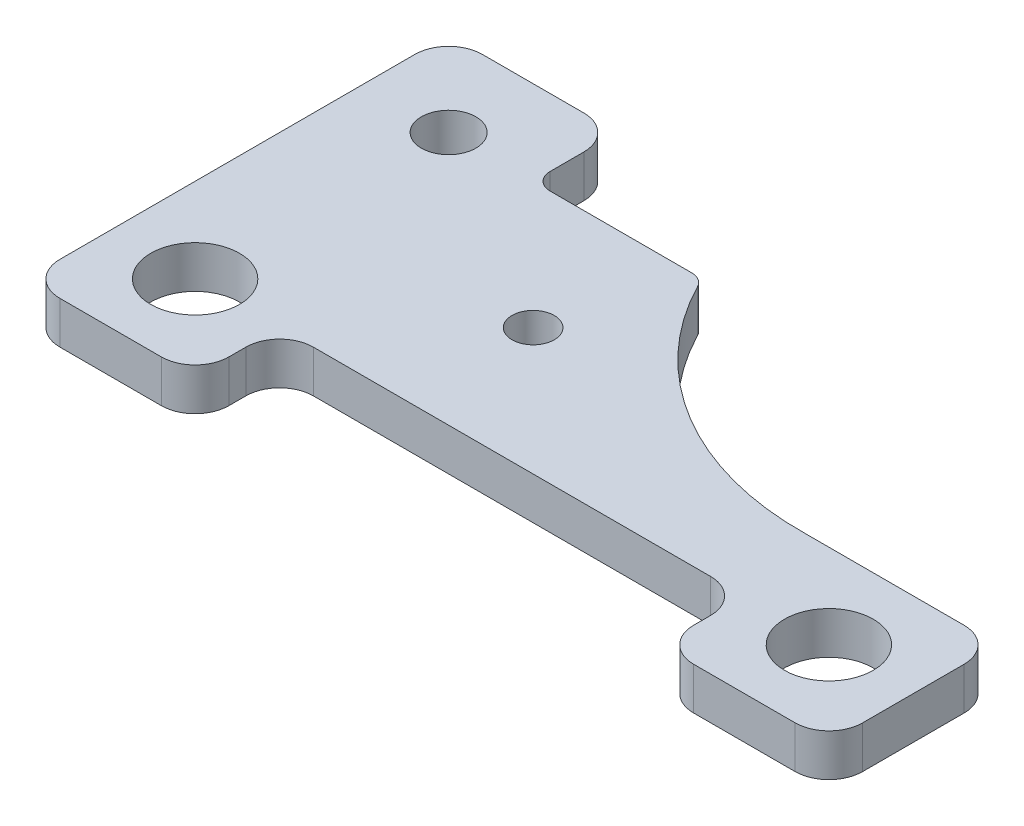
ISO-10303-21;
HEADER;
FILE_DESCRIPTION(('STEP AP214'),'2;1');
FILE_NAME('part.step','',(''),(''),'','','');
FILE_SCHEMA(('AUTOMOTIVE_DESIGN { 1 0 10303 214 1 1 1 1 }'));
ENDSEC;
DATA;
#1=APPLICATION_CONTEXT('core data for automotive mechanical design processes');
#2=APPLICATION_PROTOCOL_DEFINITION('international standard','automotive_design',2000,#1);
#3=PRODUCT_CONTEXT('',#1,'mechanical');
#4=PRODUCT('Part','Part','',(#3));
#5=PRODUCT_RELATED_PRODUCT_CATEGORY('part','',(#4));
#6=PRODUCT_DEFINITION_FORMATION('','',#4);
#7=PRODUCT_DEFINITION_CONTEXT('part definition',#1,'design');
#8=PRODUCT_DEFINITION('design','',#6,#7);
#9=PRODUCT_DEFINITION_SHAPE('','',#8);
#10=(LENGTH_UNIT() NAMED_UNIT(*) SI_UNIT(.MILLI.,.METRE.));
#11=(NAMED_UNIT(*) PLANE_ANGLE_UNIT() SI_UNIT($,.RADIAN.));
#12=(NAMED_UNIT(*) SI_UNIT($,.STERADIAN.) SOLID_ANGLE_UNIT());
#13=UNCERTAINTY_MEASURE_WITH_UNIT(LENGTH_MEASURE(1.E-05),#10,'distance_accuracy_value','');
#14=(GEOMETRIC_REPRESENTATION_CONTEXT(3) GLOBAL_UNCERTAINTY_ASSIGNED_CONTEXT((#13)) GLOBAL_UNIT_ASSIGNED_CONTEXT((#10,
#11,#12)) REPRESENTATION_CONTEXT('',''));
#15=CARTESIAN_POINT('',(0.,0.,0.));
#16=DIRECTION('',(0.,0.,1.));
#17=DIRECTION('',(1.,0.,0.));
#18=AXIS2_PLACEMENT_3D('',#15,#16,#17);
#19=CARTESIAN_POINT('',(38.7591831153131,5.,12.));
#20=DIRECTION('',(0.,-1.,0.));
#21=DIRECTION('',(0.,0.,-1.));
#22=AXIS2_PLACEMENT_3D('',#19,#20,#21);
#23=CYLINDRICAL_SURFACE('',#22,2.);
#24=CARTESIAN_POINT('',(38.7591831153131,0.,12.));
#25=DIRECTION('',(0.,1.,0.));
#26=DIRECTION('',(0.,0.,1.));
#27=AXIS2_PLACEMENT_3D('',#24,#25,#26);
#28=CIRCLE('',#27,2.);
#29=CARTESIAN_POINT('',(38.7591831153131,0.,10.));
#30=VERTEX_POINT('',#29);
#31=CARTESIAN_POINT('',(40.5357368291254,0.,11.0813831582538));
#32=VERTEX_POINT('',#31);
#33=EDGE_CURVE('E311',#30,#32,#28,.F.);
#34=ORIENTED_EDGE('',*,*,#33,.F.);
#35=DIRECTION('',(0.,-1.,0.));
#36=VECTOR('',#35,1.);
#37=CARTESIAN_POINT('',(38.7591831153131,5.,10.));
#38=LINE('',#37,#36);
#39=CARTESIAN_POINT('',(38.7591831153131,5.,10.));
#40=VERTEX_POINT('',#39);
#41=EDGE_CURVE('E11',#40,#30,#38,.T.);
#42=ORIENTED_EDGE('',*,*,#41,.F.);
#43=CARTESIAN_POINT('',(38.7591831153131,5.,12.));
#44=DIRECTION('',(0.,1.,0.));
#45=DIRECTION('',(0.,0.,1.));
#46=AXIS2_PLACEMENT_3D('',#43,#44,#45);
#47=CIRCLE('',#46,2.);
#48=CARTESIAN_POINT('',(40.5357368291254,5.,11.0813831582538));
#49=VERTEX_POINT('',#48);
#50=EDGE_CURVE('E586',#40,#49,#47,.F.);
#51=ORIENTED_EDGE('',*,*,#50,.T.);
#52=DIRECTION('',(0.,-1.,0.));
#53=VECTOR('',#52,1.);
#54=CARTESIAN_POINT('',(40.5357368291254,5.,11.0813831582538));
#55=LINE('',#54,#53);
#56=EDGE_CURVE('E57',#49,#32,#55,.T.);
#57=ORIENTED_EDGE('',*,*,#56,.T.);
#58=EDGE_LOOP('',(#34,#42,#51,#57));
#59=FACE_BOUND('',#58,.T.);
#60=ADVANCED_FACE('F39',(#59),#23,.T.);
#61=CARTESIAN_POINT('',(0.,5.,10.));
#62=DIRECTION('',(0.,0.,-1.));
#63=DIRECTION('',(-1.,0.,0.));
#64=AXIS2_PLACEMENT_3D('',#61,#62,#63);
#65=PLANE('',#64);
#66=DIRECTION('',(1.,0.,0.));
#67=VECTOR('',#66,1.);
#68=CARTESIAN_POINT('',(0.,0.,10.));
#69=LINE('',#68,#67);
#70=CARTESIAN_POINT('',(22.,0.,10.));
#71=VERTEX_POINT('',#70);
#72=EDGE_CURVE('E307',#71,#30,#69,.T.);
#73=ORIENTED_EDGE('',*,*,#72,.F.);
#74=DIRECTION('',(0.,-1.,0.));
#75=VECTOR('',#74,1.);
#76=CARTESIAN_POINT('',(22.,5.,10.));
#77=LINE('',#76,#75);
#78=CARTESIAN_POINT('',(22.,5.,10.));
#79=VERTEX_POINT('',#78);
#80=EDGE_CURVE('E49',#79,#71,#77,.T.);
#81=ORIENTED_EDGE('',*,*,#80,.F.);
#82=DIRECTION('',(1.,0.,0.));
#83=VECTOR('',#82,1.);
#84=CARTESIAN_POINT('',(0.,5.,10.));
#85=LINE('',#84,#83);
#86=EDGE_CURVE('E590',#79,#40,#85,.T.);
#87=ORIENTED_EDGE('',*,*,#86,.T.);
#88=ORIENTED_EDGE('',*,*,#41,.T.);
#89=EDGE_LOOP('',(#73,#81,#87,#88));
#90=FACE_BOUND('',#89,.T.);
#91=ADVANCED_FACE('F308',(#90),#65,.T.);
#92=CARTESIAN_POINT('',(22.,5.,8.));
#93=DIRECTION('',(0.,-1.,0.));
#94=DIRECTION('',(0.,0.,-1.));
#95=AXIS2_PLACEMENT_3D('',#92,#93,#94);
#96=CYLINDRICAL_SURFACE('',#95,2.);
#97=CARTESIAN_POINT('',(22.,0.,8.));
#98=DIRECTION('',(0.,1.,0.));
#99=DIRECTION('',(0.,0.,1.));
#100=AXIS2_PLACEMENT_3D('',#97,#98,#99);
#101=CIRCLE('',#100,2.);
#102=CARTESIAN_POINT('',(20.,0.,7.99999999999999));
#103=VERTEX_POINT('',#102);
#104=EDGE_CURVE('E299',#103,#71,#101,.T.);
#105=ORIENTED_EDGE('',*,*,#104,.F.);
#106=DIRECTION('',(0.,-1.,0.));
#107=VECTOR('',#106,1.);
#108=CARTESIAN_POINT('',(20.,5.,7.99999999999999));
#109=LINE('',#108,#107);
#110=CARTESIAN_POINT('',(20.,5.,7.99999999999999));
#111=VERTEX_POINT('',#110);
#112=EDGE_CURVE('E290',#111,#103,#109,.T.);
#113=ORIENTED_EDGE('',*,*,#112,.F.);
#114=CARTESIAN_POINT('',(22.,5.,8.));
#115=DIRECTION('',(0.,1.,0.));
#116=DIRECTION('',(0.,0.,1.));
#117=AXIS2_PLACEMENT_3D('',#114,#115,#116);
#118=CIRCLE('',#117,2.);
#119=EDGE_CURVE('E302',#111,#79,#118,.T.);
#120=ORIENTED_EDGE('',*,*,#119,.T.);
#121=ORIENTED_EDGE('',*,*,#80,.T.);
#122=EDGE_LOOP('',(#105,#113,#120,#121));
#123=FACE_BOUND('',#122,.T.);
#124=ADVANCED_FACE('F297',(#123),#96,.F.);
#125=CARTESIAN_POINT('',(20.,5.,0.));
#126=DIRECTION('',(1.,0.,0.));
#127=DIRECTION('',(0.,0.,-1.));
#128=AXIS2_PLACEMENT_3D('',#125,#126,#127);
#129=PLANE('',#128);
#130=DIRECTION('',(0.,0.,1.));
#131=VECTOR('',#130,1.);
#132=CARTESIAN_POINT('',(20.,0.,0.));
#133=LINE('',#132,#131);
#134=CARTESIAN_POINT('',(20.,0.,4.00000000000003));
#135=VERTEX_POINT('',#134);
#136=EDGE_CURVE('E317',#135,#103,#133,.T.);
#137=ORIENTED_EDGE('',*,*,#136,.F.);
#138=DIRECTION('',(0.,-1.,0.));
#139=VECTOR('',#138,1.);
#140=CARTESIAN_POINT('',(20.,5.,4.00000000000003));
#141=LINE('',#140,#139);
#142=CARTESIAN_POINT('',(20.,5.,4.00000000000003));
#143=VERTEX_POINT('',#142);
#144=EDGE_CURVE('E287',#143,#135,#141,.T.);
#145=ORIENTED_EDGE('',*,*,#144,.F.);
#146=DIRECTION('',(0.,0.,1.));
#147=VECTOR('',#146,1.);
#148=CARTESIAN_POINT('',(20.,5.,0.));
#149=LINE('',#148,#147);
#150=EDGE_CURVE('E598',#143,#111,#149,.T.);
#151=ORIENTED_EDGE('',*,*,#150,.T.);
#152=ORIENTED_EDGE('',*,*,#112,.T.);
#153=EDGE_LOOP('',(#137,#145,#151,#152));
#154=FACE_BOUND('',#153,.T.);
#155=ADVANCED_FACE('F447',(#154),#129,.T.);
#156=CARTESIAN_POINT('',(16.,5.,4.));
#157=DIRECTION('',(0.,-1.,0.));
#158=DIRECTION('',(0.,0.,-1.));
#159=AXIS2_PLACEMENT_3D('',#156,#157,#158);
#160=CYLINDRICAL_SURFACE('',#159,4.);
#161=CARTESIAN_POINT('',(16.,0.,4.));
#162=DIRECTION('',(0.,1.,0.));
#163=DIRECTION('',(0.,0.,1.));
#164=AXIS2_PLACEMENT_3D('',#161,#162,#163);
#165=CIRCLE('',#164,4.);
#166=CARTESIAN_POINT('',(16.,0.,0.));
#167=VERTEX_POINT('',#166);
#168=EDGE_CURVE('E321',#167,#135,#165,.F.);
#169=ORIENTED_EDGE('',*,*,#168,.F.);
#170=DIRECTION('',(0.,-1.,0.));
#171=VECTOR('',#170,1.);
#172=CARTESIAN_POINT('',(16.,5.,0.));
#173=LINE('',#172,#171);
#174=CARTESIAN_POINT('',(16.,5.,0.));
#175=VERTEX_POINT('',#174);
#176=EDGE_CURVE('E284',#175,#167,#173,.T.);
#177=ORIENTED_EDGE('',*,*,#176,.F.);
#178=CARTESIAN_POINT('',(16.,5.,4.));
#179=DIRECTION('',(0.,1.,0.));
#180=DIRECTION('',(0.,0.,1.));
#181=AXIS2_PLACEMENT_3D('',#178,#179,#180);
#182=CIRCLE('',#181,4.);
#183=EDGE_CURVE('E602',#175,#143,#182,.F.);
#184=ORIENTED_EDGE('',*,*,#183,.T.);
#185=ORIENTED_EDGE('',*,*,#144,.T.);
#186=EDGE_LOOP('',(#169,#177,#184,#185));
#187=FACE_BOUND('',#186,.T.);
#188=ADVANCED_FACE('F450',(#187),#160,.T.);
#189=CARTESIAN_POINT('',(0.,5.,0.));
#190=DIRECTION('',(0.,0.,-1.));
#191=DIRECTION('',(-1.,0.,0.));
#192=AXIS2_PLACEMENT_3D('',#189,#190,#191);
#193=PLANE('',#192);
#194=DIRECTION('',(1.,0.,0.));
#195=VECTOR('',#194,1.);
#196=CARTESIAN_POINT('',(0.,0.,0.));
#197=LINE('',#196,#195);
#198=CARTESIAN_POINT('',(4.00000000000003,0.,0.));
#199=VERTEX_POINT('',#198);
#200=EDGE_CURVE('E327',#199,#167,#197,.T.);
#201=ORIENTED_EDGE('',*,*,#200,.F.);
#202=DIRECTION('',(0.,-1.,0.));
#203=VECTOR('',#202,1.);
#204=CARTESIAN_POINT('',(4.00000000000003,5.,0.));
#205=LINE('',#204,#203);
#206=CARTESIAN_POINT('',(4.00000000000003,5.,0.));
#207=VERTEX_POINT('',#206);
#208=EDGE_CURVE('E281',#207,#199,#205,.T.);
#209=ORIENTED_EDGE('',*,*,#208,.F.);
#210=DIRECTION('',(1.,0.,0.));
#211=VECTOR('',#210,1.);
#212=CARTESIAN_POINT('',(0.,5.,0.));
#213=LINE('',#212,#211);
#214=EDGE_CURVE('E606',#207,#175,#213,.T.);
#215=ORIENTED_EDGE('',*,*,#214,.T.);
#216=ORIENTED_EDGE('',*,*,#176,.T.);
#217=EDGE_LOOP('',(#201,#209,#215,#216));
#218=FACE_BOUND('',#217,.T.);
#219=ADVANCED_FACE('F454',(#218),#193,.T.);
#220=CARTESIAN_POINT('',(4.,5.,4.));
#221=DIRECTION('',(0.,-1.,0.));
#222=DIRECTION('',(0.,0.,-1.));
#223=AXIS2_PLACEMENT_3D('',#220,#221,#222);
#224=CYLINDRICAL_SURFACE('',#223,4.);
#225=CARTESIAN_POINT('',(4.,0.,4.));
#226=DIRECTION('',(0.,1.,0.));
#227=DIRECTION('',(0.,0.,1.));
#228=AXIS2_PLACEMENT_3D('',#225,#226,#227);
#229=CIRCLE('',#228,4.);
#230=CARTESIAN_POINT('',(0.,0.,4.00000000000003));
#231=VERTEX_POINT('',#230);
#232=EDGE_CURVE('E331',#231,#199,#229,.F.);
#233=ORIENTED_EDGE('',*,*,#232,.F.);
#234=DIRECTION('',(0.,-1.,0.));
#235=VECTOR('',#234,1.);
#236=CARTESIAN_POINT('',(0.,5.,4.00000000000003));
#237=LINE('',#236,#235);
#238=CARTESIAN_POINT('',(0.,5.,4.00000000000003));
#239=VERTEX_POINT('',#238);
#240=EDGE_CURVE('E278',#239,#231,#237,.T.);
#241=ORIENTED_EDGE('',*,*,#240,.F.);
#242=CARTESIAN_POINT('',(4.,5.,4.));
#243=DIRECTION('',(0.,1.,0.));
#244=DIRECTION('',(0.,0.,1.));
#245=AXIS2_PLACEMENT_3D('',#242,#243,#244);
#246=CIRCLE('',#245,4.);
#247=EDGE_CURVE('E610',#239,#207,#246,.F.);
#248=ORIENTED_EDGE('',*,*,#247,.T.);
#249=ORIENTED_EDGE('',*,*,#208,.T.);
#250=EDGE_LOOP('',(#233,#241,#248,#249));
#251=FACE_BOUND('',#250,.T.);
#252=ADVANCED_FACE('F458',(#251),#224,.T.);
#253=CARTESIAN_POINT('',(0.,5.,0.));
#254=DIRECTION('',(1.,0.,0.));
#255=DIRECTION('',(0.,0.,-1.));
#256=AXIS2_PLACEMENT_3D('',#253,#254,#255);
#257=PLANE('',#256);
#258=DIRECTION('',(0.,0.,1.));
#259=VECTOR('',#258,1.);
#260=CARTESIAN_POINT('',(0.,0.,0.));
#261=LINE('',#260,#259);
#262=CARTESIAN_POINT('',(0.,0.,46.));
#263=VERTEX_POINT('',#262);
#264=EDGE_CURVE('E335',#231,#263,#261,.T.);
#265=ORIENTED_EDGE('',*,*,#264,.T.);
#266=DIRECTION('',(0.,-1.,0.));
#267=VECTOR('',#266,1.);
#268=CARTESIAN_POINT('',(0.,5.,46.));
#269=LINE('',#268,#267);
#270=CARTESIAN_POINT('',(0.,5.,46.));
#271=VERTEX_POINT('',#270);
#272=EDGE_CURVE('E274',#271,#263,#269,.T.);
#273=ORIENTED_EDGE('',*,*,#272,.F.);
#274=DIRECTION('',(0.,0.,1.));
#275=VECTOR('',#274,1.);
#276=CARTESIAN_POINT('',(0.,5.,0.));
#277=LINE('',#276,#275);
#278=EDGE_CURVE('E614',#239,#271,#277,.T.);
#279=ORIENTED_EDGE('',*,*,#278,.F.);
#280=ORIENTED_EDGE('',*,*,#240,.T.);
#281=EDGE_LOOP('',(#265,#273,#279,#280));
#282=FACE_BOUND('',#281,.T.);
#283=ADVANCED_FACE('F462',(#282),#257,.F.);
#284=CARTESIAN_POINT('',(4.,5.,46.));
#285=DIRECTION('',(0.,-1.,0.));
#286=DIRECTION('',(0.,0.,-1.));
#287=AXIS2_PLACEMENT_3D('',#284,#285,#286);
#288=CYLINDRICAL_SURFACE('',#287,4.);
#289=CARTESIAN_POINT('',(4.,0.,46.));
#290=DIRECTION('',(0.,1.,0.));
#291=DIRECTION('',(0.,0.,1.));
#292=AXIS2_PLACEMENT_3D('',#289,#290,#291);
#293=CIRCLE('',#292,4.);
#294=CARTESIAN_POINT('',(4.00000000000003,0.,50.));
#295=VERTEX_POINT('',#294);
#296=EDGE_CURVE('E339',#263,#295,#293,.T.);
#297=ORIENTED_EDGE('',*,*,#296,.T.);
#298=DIRECTION('',(0.,-1.,0.));
#299=VECTOR('',#298,1.);
#300=CARTESIAN_POINT('',(4.00000000000003,5.,50.));
#301=LINE('',#300,#299);
#302=CARTESIAN_POINT('',(4.00000000000003,5.,50.));
#303=VERTEX_POINT('',#302);
#304=EDGE_CURVE('E270',#303,#295,#301,.T.);
#305=ORIENTED_EDGE('',*,*,#304,.F.);
#306=CARTESIAN_POINT('',(4.,5.,46.));
#307=DIRECTION('',(0.,1.,0.));
#308=DIRECTION('',(0.,0.,1.));
#309=AXIS2_PLACEMENT_3D('',#306,#307,#308);
#310=CIRCLE('',#309,4.);
#311=EDGE_CURVE('E618',#271,#303,#310,.T.);
#312=ORIENTED_EDGE('',*,*,#311,.F.);
#313=ORIENTED_EDGE('',*,*,#272,.T.);
#314=EDGE_LOOP('',(#297,#305,#312,#313));
#315=FACE_BOUND('',#314,.T.);
#316=ADVANCED_FACE('F466',(#315),#288,.T.);
#317=CARTESIAN_POINT('',(0.,5.,50.));
#318=DIRECTION('',(0.,0.,-1.));
#319=DIRECTION('',(-1.,0.,0.));
#320=AXIS2_PLACEMENT_3D('',#317,#318,#319);
#321=PLANE('',#320);
#322=DIRECTION('',(1.,0.,0.));
#323=VECTOR('',#322,1.);
#324=CARTESIAN_POINT('',(0.,0.,50.));
#325=LINE('',#324,#323);
#326=CARTESIAN_POINT('',(16.,0.,50.));
#327=VERTEX_POINT('',#326);
#328=EDGE_CURVE('E343',#295,#327,#325,.T.);
#329=ORIENTED_EDGE('',*,*,#328,.T.);
#330=DIRECTION('',(0.,-1.,0.));
#331=VECTOR('',#330,1.);
#332=CARTESIAN_POINT('',(16.,5.,50.));
#333=LINE('',#332,#331);
#334=CARTESIAN_POINT('',(16.,5.,50.));
#335=VERTEX_POINT('',#334);
#336=EDGE_CURVE('E266',#335,#327,#333,.T.);
#337=ORIENTED_EDGE('',*,*,#336,.F.);
#338=DIRECTION('',(1.,0.,0.));
#339=VECTOR('',#338,1.);
#340=CARTESIAN_POINT('',(0.,5.,50.));
#341=LINE('',#340,#339);
#342=EDGE_CURVE('E622',#303,#335,#341,.T.);
#343=ORIENTED_EDGE('',*,*,#342,.F.);
#344=ORIENTED_EDGE('',*,*,#304,.T.);
#345=EDGE_LOOP('',(#329,#337,#343,#344));
#346=FACE_BOUND('',#345,.T.);
#347=ADVANCED_FACE('F470',(#346),#321,.F.);
#348=CARTESIAN_POINT('',(16.,5.,46.));
#349=DIRECTION('',(0.,-1.,0.));
#350=DIRECTION('',(0.,0.,-1.));
#351=AXIS2_PLACEMENT_3D('',#348,#349,#350);
#352=CYLINDRICAL_SURFACE('',#351,4.);
#353=CARTESIAN_POINT('',(16.,0.,46.));
#354=DIRECTION('',(0.,1.,0.));
#355=DIRECTION('',(0.,0.,1.));
#356=AXIS2_PLACEMENT_3D('',#353,#354,#355);
#357=CIRCLE('',#356,4.);
#358=CARTESIAN_POINT('',(20.,0.,46.));
#359=VERTEX_POINT('',#358);
#360=EDGE_CURVE('E347',#327,#359,#357,.T.);
#361=ORIENTED_EDGE('',*,*,#360,.T.);
#362=DIRECTION('',(0.,-1.,0.));
#363=VECTOR('',#362,1.);
#364=CARTESIAN_POINT('',(20.,5.,46.));
#365=LINE('',#364,#363);
#366=CARTESIAN_POINT('',(20.,5.,46.));
#367=VERTEX_POINT('',#366);
#368=EDGE_CURVE('E262',#367,#359,#365,.T.);
#369=ORIENTED_EDGE('',*,*,#368,.F.);
#370=CARTESIAN_POINT('',(16.,5.,46.));
#371=DIRECTION('',(0.,1.,0.));
#372=DIRECTION('',(0.,0.,1.));
#373=AXIS2_PLACEMENT_3D('',#370,#371,#372);
#374=CIRCLE('',#373,4.);
#375=EDGE_CURVE('E626',#335,#367,#374,.T.);
#376=ORIENTED_EDGE('',*,*,#375,.F.);
#377=ORIENTED_EDGE('',*,*,#336,.T.);
#378=EDGE_LOOP('',(#361,#369,#376,#377));
#379=FACE_BOUND('',#378,.T.);
#380=ADVANCED_FACE('F474',(#379),#352,.T.);
#381=CARTESIAN_POINT('',(20.,5.,0.));
#382=DIRECTION('',(-1.,0.,0.));
#383=DIRECTION('',(0.,0.,1.));
#384=AXIS2_PLACEMENT_3D('',#381,#382,#383);
#385=PLANE('',#384);
#386=DIRECTION('',(0.,0.,-1.));
#387=VECTOR('',#386,1.);
#388=CARTESIAN_POINT('',(20.,0.,0.));
#389=LINE('',#388,#387);
#390=CARTESIAN_POINT('',(20.,0.,44.));
#391=VERTEX_POINT('',#390);
#392=EDGE_CURVE('E351',#359,#391,#389,.T.);
#393=ORIENTED_EDGE('',*,*,#392,.T.);
#394=DIRECTION('',(0.,-1.,0.));
#395=VECTOR('',#394,1.);
#396=CARTESIAN_POINT('',(20.,5.,44.));
#397=LINE('',#396,#395);
#398=CARTESIAN_POINT('',(20.,5.,44.));
#399=VERTEX_POINT('',#398);
#400=EDGE_CURVE('E258',#399,#391,#397,.T.);
#401=ORIENTED_EDGE('',*,*,#400,.F.);
#402=DIRECTION('',(0.,0.,-1.));
#403=VECTOR('',#402,1.);
#404=CARTESIAN_POINT('',(20.,5.,0.));
#405=LINE('',#404,#403);
#406=EDGE_CURVE('E630',#367,#399,#405,.T.);
#407=ORIENTED_EDGE('',*,*,#406,.F.);
#408=ORIENTED_EDGE('',*,*,#368,.T.);
#409=EDGE_LOOP('',(#393,#401,#407,#408));
#410=FACE_BOUND('',#409,.T.);
#411=ADVANCED_FACE('F478',(#410),#385,.F.);
#412=CARTESIAN_POINT('',(24.,5.,44.));
#413=DIRECTION('',(0.,-1.,0.));
#414=DIRECTION('',(0.,0.,-1.));
#415=AXIS2_PLACEMENT_3D('',#412,#413,#414);
#416=CYLINDRICAL_SURFACE('',#415,4.);
#417=CARTESIAN_POINT('',(24.,0.,44.));
#418=DIRECTION('',(0.,1.,0.));
#419=DIRECTION('',(0.,0.,1.));
#420=AXIS2_PLACEMENT_3D('',#417,#418,#419);
#421=CIRCLE('',#420,4.);
#422=CARTESIAN_POINT('',(24.,0.,40.));
#423=VERTEX_POINT('',#422);
#424=EDGE_CURVE('E355',#391,#423,#421,.F.);
#425=ORIENTED_EDGE('',*,*,#424,.T.);
#426=DIRECTION('',(0.,-1.,0.));
#427=VECTOR('',#426,1.);
#428=CARTESIAN_POINT('',(24.,5.,40.));
#429=LINE('',#428,#427);
#430=CARTESIAN_POINT('',(24.,5.,40.));
#431=VERTEX_POINT('',#430);
#432=EDGE_CURVE('E254',#431,#423,#429,.T.);
#433=ORIENTED_EDGE('',*,*,#432,.F.);
#434=CARTESIAN_POINT('',(24.,5.,44.));
#435=DIRECTION('',(0.,1.,0.));
#436=DIRECTION('',(0.,0.,1.));
#437=AXIS2_PLACEMENT_3D('',#434,#435,#436);
#438=CIRCLE('',#437,4.);
#439=EDGE_CURVE('E634',#399,#431,#438,.F.);
#440=ORIENTED_EDGE('',*,*,#439,.F.);
#441=ORIENTED_EDGE('',*,*,#400,.T.);
#442=EDGE_LOOP('',(#425,#433,#440,#441));
#443=FACE_BOUND('',#442,.T.);
#444=ADVANCED_FACE('F482',(#443),#416,.F.);
#445=CARTESIAN_POINT('',(0.,5.,40.));
#446=DIRECTION('',(0.,0.,-1.));
#447=DIRECTION('',(-1.,0.,0.));
#448=AXIS2_PLACEMENT_3D('',#445,#446,#447);
#449=PLANE('',#448);
#450=DIRECTION('',(1.,0.,0.));
#451=VECTOR('',#450,1.);
#452=CARTESIAN_POINT('',(0.,0.,40.));
#453=LINE('',#452,#451);
#454=CARTESIAN_POINT('',(71.,0.,40.));
#455=VERTEX_POINT('',#454);
#456=EDGE_CURVE('E359',#423,#455,#453,.T.);
#457=ORIENTED_EDGE('',*,*,#456,.T.);
#458=DIRECTION('',(0.,-1.,0.));
#459=VECTOR('',#458,1.);
#460=CARTESIAN_POINT('',(71.,5.,40.));
#461=LINE('',#460,#459);
#462=CARTESIAN_POINT('',(71.,5.,40.));
#463=VERTEX_POINT('',#462);
#464=EDGE_CURVE('E250',#463,#455,#461,.T.);
#465=ORIENTED_EDGE('',*,*,#464,.F.);
#466=DIRECTION('',(1.,0.,0.));
#467=VECTOR('',#466,1.);
#468=CARTESIAN_POINT('',(0.,5.,40.));
#469=LINE('',#468,#467);
#470=EDGE_CURVE('E638',#431,#463,#469,.T.);
#471=ORIENTED_EDGE('',*,*,#470,.F.);
#472=ORIENTED_EDGE('',*,*,#432,.T.);
#473=EDGE_LOOP('',(#457,#465,#471,#472));
#474=FACE_BOUND('',#473,.T.);
#475=ADVANCED_FACE('F486',(#474),#449,.F.);
#476=CARTESIAN_POINT('',(71.,5.,44.));
#477=DIRECTION('',(0.,-1.,0.));
#478=DIRECTION('',(0.,0.,-1.));
#479=AXIS2_PLACEMENT_3D('',#476,#477,#478);
#480=CYLINDRICAL_SURFACE('',#479,4.);
#481=CARTESIAN_POINT('',(71.,0.,44.));
#482=DIRECTION('',(0.,1.,0.));
#483=DIRECTION('',(0.,0.,1.));
#484=AXIS2_PLACEMENT_3D('',#481,#482,#483);
#485=CIRCLE('',#484,4.);
#486=CARTESIAN_POINT('',(75.,0.,44.));
#487=VERTEX_POINT('',#486);
#488=EDGE_CURVE('E363',#455,#487,#485,.F.);
#489=ORIENTED_EDGE('',*,*,#488,.T.);
#490=DIRECTION('',(0.,-1.,0.));
#491=VECTOR('',#490,1.);
#492=CARTESIAN_POINT('',(75.,5.,44.));
#493=LINE('',#492,#491);
#494=CARTESIAN_POINT('',(75.,5.,44.));
#495=VERTEX_POINT('',#494);
#496=EDGE_CURVE('E246',#495,#487,#493,.T.);
#497=ORIENTED_EDGE('',*,*,#496,.F.);
#498=CARTESIAN_POINT('',(71.,5.,44.));
#499=DIRECTION('',(0.,1.,0.));
#500=DIRECTION('',(0.,0.,1.));
#501=AXIS2_PLACEMENT_3D('',#498,#499,#500);
#502=CIRCLE('',#501,4.);
#503=EDGE_CURVE('E642',#463,#495,#502,.F.);
#504=ORIENTED_EDGE('',*,*,#503,.F.);
#505=ORIENTED_EDGE('',*,*,#464,.T.);
#506=EDGE_LOOP('',(#489,#497,#504,#505));
#507=FACE_BOUND('',#506,.T.);
#508=ADVANCED_FACE('F490',(#507),#480,.F.);
#509=CARTESIAN_POINT('',(75.,5.,0.));
#510=DIRECTION('',(1.,0.,0.));
#511=DIRECTION('',(0.,0.,-1.));
#512=AXIS2_PLACEMENT_3D('',#509,#510,#511);
#513=PLANE('',#512);
#514=DIRECTION('',(0.,0.,1.));
#515=VECTOR('',#514,1.);
#516=CARTESIAN_POINT('',(75.,0.,0.));
#517=LINE('',#516,#515);
#518=CARTESIAN_POINT('',(75.,0.,46.));
#519=VERTEX_POINT('',#518);
#520=EDGE_CURVE('E367',#487,#519,#517,.T.);
#521=ORIENTED_EDGE('',*,*,#520,.T.);
#522=DIRECTION('',(0.,-1.,0.));
#523=VECTOR('',#522,1.);
#524=CARTESIAN_POINT('',(75.,5.,46.));
#525=LINE('',#524,#523);
#526=CARTESIAN_POINT('',(75.,5.,46.));
#527=VERTEX_POINT('',#526);
#528=EDGE_CURVE('E242',#527,#519,#525,.T.);
#529=ORIENTED_EDGE('',*,*,#528,.F.);
#530=DIRECTION('',(0.,0.,1.));
#531=VECTOR('',#530,1.);
#532=CARTESIAN_POINT('',(75.,5.,0.));
#533=LINE('',#532,#531);
#534=EDGE_CURVE('E646',#495,#527,#533,.T.);
#535=ORIENTED_EDGE('',*,*,#534,.F.);
#536=ORIENTED_EDGE('',*,*,#496,.T.);
#537=EDGE_LOOP('',(#521,#529,#535,#536));
#538=FACE_BOUND('',#537,.T.);
#539=ADVANCED_FACE('F494',(#538),#513,.F.);
#540=CARTESIAN_POINT('',(79.,5.,46.));
#541=DIRECTION('',(0.,-1.,0.));
#542=DIRECTION('',(0.,0.,-1.));
#543=AXIS2_PLACEMENT_3D('',#540,#541,#542);
#544=CYLINDRICAL_SURFACE('',#543,4.);
#545=CARTESIAN_POINT('',(79.,0.,46.));
#546=DIRECTION('',(0.,1.,0.));
#547=DIRECTION('',(0.,0.,1.));
#548=AXIS2_PLACEMENT_3D('',#545,#546,#547);
#549=CIRCLE('',#548,4.);
#550=CARTESIAN_POINT('',(79.,0.,50.));
#551=VERTEX_POINT('',#550);
#552=EDGE_CURVE('E371',#519,#551,#549,.T.);
#553=ORIENTED_EDGE('',*,*,#552,.T.);
#554=DIRECTION('',(0.,-1.,0.));
#555=VECTOR('',#554,1.);
#556=CARTESIAN_POINT('',(79.,5.,50.));
#557=LINE('',#556,#555);
#558=CARTESIAN_POINT('',(79.,5.,50.));
#559=VERTEX_POINT('',#558);
#560=EDGE_CURVE('E238',#559,#551,#557,.T.);
#561=ORIENTED_EDGE('',*,*,#560,.F.);
#562=CARTESIAN_POINT('',(79.,5.,46.));
#563=DIRECTION('',(0.,1.,0.));
#564=DIRECTION('',(0.,0.,1.));
#565=AXIS2_PLACEMENT_3D('',#562,#563,#564);
#566=CIRCLE('',#565,4.);
#567=EDGE_CURVE('E650',#527,#559,#566,.T.);
#568=ORIENTED_EDGE('',*,*,#567,.F.);
#569=ORIENTED_EDGE('',*,*,#528,.T.);
#570=EDGE_LOOP('',(#553,#561,#568,#569));
#571=FACE_BOUND('',#570,.T.);
#572=ADVANCED_FACE('F498',(#571),#544,.T.);
#573=CARTESIAN_POINT('',(0.,5.,50.));
#574=DIRECTION('',(0.,0.,-1.));
#575=DIRECTION('',(-1.,0.,0.));
#576=AXIS2_PLACEMENT_3D('',#573,#574,#575);
#577=PLANE('',#576);
#578=DIRECTION('',(1.,0.,0.));
#579=VECTOR('',#578,1.);
#580=CARTESIAN_POINT('',(0.,0.,50.));
#581=LINE('',#580,#579);
#582=CARTESIAN_POINT('',(91.,0.,50.));
#583=VERTEX_POINT('',#582);
#584=EDGE_CURVE('E375',#551,#583,#581,.T.);
#585=ORIENTED_EDGE('',*,*,#584,.T.);
#586=DIRECTION('',(0.,-1.,0.));
#587=VECTOR('',#586,1.);
#588=CARTESIAN_POINT('',(91.,5.,50.));
#589=LINE('',#588,#587);
#590=CARTESIAN_POINT('',(91.,5.,50.));
#591=VERTEX_POINT('',#590);
#592=EDGE_CURVE('E234',#591,#583,#589,.T.);
#593=ORIENTED_EDGE('',*,*,#592,.F.);
#594=DIRECTION('',(1.,0.,0.));
#595=VECTOR('',#594,1.);
#596=CARTESIAN_POINT('',(0.,5.,50.));
#597=LINE('',#596,#595);
#598=EDGE_CURVE('E654',#559,#591,#597,.T.);
#599=ORIENTED_EDGE('',*,*,#598,.F.);
#600=ORIENTED_EDGE('',*,*,#560,.T.);
#601=EDGE_LOOP('',(#585,#593,#599,#600));
#602=FACE_BOUND('',#601,.T.);
#603=ADVANCED_FACE('F502',(#602),#577,.F.);
#604=CARTESIAN_POINT('',(91.,5.,46.));
#605=DIRECTION('',(0.,-1.,0.));
#606=DIRECTION('',(0.,0.,-1.));
#607=AXIS2_PLACEMENT_3D('',#604,#605,#606);
#608=CYLINDRICAL_SURFACE('',#607,4.);
#609=CARTESIAN_POINT('',(91.,0.,46.));
#610=DIRECTION('',(0.,1.,0.));
#611=DIRECTION('',(0.,0.,1.));
#612=AXIS2_PLACEMENT_3D('',#609,#610,#611);
#613=CIRCLE('',#612,4.);
#614=CARTESIAN_POINT('',(95.,0.,46.));
#615=VERTEX_POINT('',#614);
#616=EDGE_CURVE('E379',#583,#615,#613,.T.);
#617=ORIENTED_EDGE('',*,*,#616,.T.);
#618=DIRECTION('',(0.,-1.,0.));
#619=VECTOR('',#618,1.);
#620=CARTESIAN_POINT('',(95.,5.,46.));
#621=LINE('',#620,#619);
#622=CARTESIAN_POINT('',(95.,5.,46.));
#623=VERTEX_POINT('',#622);
#624=EDGE_CURVE('E226',#623,#615,#621,.T.);
#625=ORIENTED_EDGE('',*,*,#624,.F.);
#626=CARTESIAN_POINT('',(91.,5.,46.));
#627=DIRECTION('',(0.,1.,0.));
#628=DIRECTION('',(0.,0.,1.));
#629=AXIS2_PLACEMENT_3D('',#626,#627,#628);
#630=CIRCLE('',#629,4.);
#631=EDGE_CURVE('E658',#591,#623,#630,.T.);
#632=ORIENTED_EDGE('',*,*,#631,.F.);
#633=ORIENTED_EDGE('',*,*,#592,.T.);
#634=EDGE_LOOP('',(#617,#625,#632,#633));
#635=FACE_BOUND('',#634,.T.);
#636=ADVANCED_FACE('F506',(#635),#608,.T.);
#637=CARTESIAN_POINT('',(95.,5.,0.));
#638=DIRECTION('',(-1.,0.,0.));
#639=DIRECTION('',(0.,0.,1.));
#640=AXIS2_PLACEMENT_3D('',#637,#638,#639);
#641=PLANE('',#640);
#642=DIRECTION('',(0.,0.,-1.));
#643=VECTOR('',#642,1.);
#644=CARTESIAN_POINT('',(95.,0.,0.));
#645=LINE('',#644,#643);
#646=CARTESIAN_POINT('',(95.,0.,34.));
#647=VERTEX_POINT('',#646);
#648=EDGE_CURVE('E383',#615,#647,#645,.T.);
#649=ORIENTED_EDGE('',*,*,#648,.T.);
#650=DIRECTION('',(0.,-1.,0.));
#651=VECTOR('',#650,1.);
#652=CARTESIAN_POINT('',(95.,5.,34.));
#653=LINE('',#652,#651);
#654=CARTESIAN_POINT('',(95.,5.,34.));
#655=VERTEX_POINT('',#654);
#656=EDGE_CURVE('E222',#655,#647,#653,.T.);
#657=ORIENTED_EDGE('',*,*,#656,.F.);
#658=DIRECTION('',(0.,0.,-1.));
#659=VECTOR('',#658,1.);
#660=CARTESIAN_POINT('',(95.,5.,0.));
#661=LINE('',#660,#659);
#662=EDGE_CURVE('E213',#623,#655,#661,.T.);
#663=ORIENTED_EDGE('',*,*,#662,.F.);
#664=ORIENTED_EDGE('',*,*,#624,.T.);
#665=EDGE_LOOP('',(#649,#657,#663,#664));
#666=FACE_BOUND('',#665,.T.);
#667=ADVANCED_FACE('F510',(#666),#641,.F.);
#668=CARTESIAN_POINT('',(91.,5.,34.));
#669=DIRECTION('',(0.,-1.,0.));
#670=DIRECTION('',(0.,0.,-1.));
#671=AXIS2_PLACEMENT_3D('',#668,#669,#670);
#672=CYLINDRICAL_SURFACE('',#671,4.);
#673=CARTESIAN_POINT('',(91.,0.,34.));
#674=DIRECTION('',(0.,1.,0.));
#675=DIRECTION('',(0.,0.,1.));
#676=AXIS2_PLACEMENT_3D('',#673,#674,#675);
#677=CIRCLE('',#676,4.);
#678=CARTESIAN_POINT('',(91.,0.,30.));
#679=VERTEX_POINT('',#678);
#680=EDGE_CURVE('E220',#647,#679,#677,.T.);
#681=ORIENTED_EDGE('',*,*,#680,.T.);
#682=DIRECTION('',(0.,-1.,0.));
#683=VECTOR('',#682,1.);
#684=CARTESIAN_POINT('',(91.,5.,30.));
#685=LINE('',#684,#683);
#686=CARTESIAN_POINT('',(91.,5.,30.));
#687=VERTEX_POINT('',#686);
#688=EDGE_CURVE('E201',#687,#679,#685,.T.);
#689=ORIENTED_EDGE('',*,*,#688,.F.);
#690=CARTESIAN_POINT('',(91.,5.,34.));
#691=DIRECTION('',(0.,1.,0.));
#692=DIRECTION('',(0.,0.,1.));
#693=AXIS2_PLACEMENT_3D('',#690,#691,#692);
#694=CIRCLE('',#693,4.);
#695=EDGE_CURVE('E207',#655,#687,#694,.T.);
#696=ORIENTED_EDGE('',*,*,#695,.F.);
#697=ORIENTED_EDGE('',*,*,#656,.T.);
#698=EDGE_LOOP('',(#681,#689,#696,#697));
#699=FACE_BOUND('',#698,.T.);
#700=ADVANCED_FACE('F219',(#699),#672,.T.);
#701=CARTESIAN_POINT('',(0.,5.,30.));
#702=DIRECTION('',(0.,0.,1.));
#703=DIRECTION('',(1.,0.,0.));
#704=AXIS2_PLACEMENT_3D('',#701,#702,#703);
#705=PLANE('',#704);
#706=DIRECTION('',(-1.,0.,0.));
#707=VECTOR('',#706,1.);
#708=CARTESIAN_POINT('',(0.,0.,30.));
#709=LINE('',#708,#707);
#710=CARTESIAN_POINT('',(72.2508536416815,0.,30.));
#711=VERTEX_POINT('',#710);
#712=EDGE_CURVE('E389',#679,#711,#709,.T.);
#713=ORIENTED_EDGE('',*,*,#712,.T.);
#714=DIRECTION('',(0.,-1.,0.));
#715=VECTOR('',#714,1.);
#716=CARTESIAN_POINT('',(72.2508536416815,5.,30.));
#717=LINE('',#716,#715);
#718=CARTESIAN_POINT('',(72.2508536416815,5.,30.));
#719=VERTEX_POINT('',#718);
#720=EDGE_CURVE('E128',#719,#711,#717,.T.);
#721=ORIENTED_EDGE('',*,*,#720,.F.);
#722=DIRECTION('',(-1.,0.,0.));
#723=VECTOR('',#722,1.);
#724=CARTESIAN_POINT('',(0.,5.,30.));
#725=LINE('',#724,#723);
#726=EDGE_CURVE('E197',#687,#719,#725,.T.);
#727=ORIENTED_EDGE('',*,*,#726,.F.);
#728=ORIENTED_EDGE('',*,*,#688,.T.);
#729=EDGE_LOOP('',(#713,#721,#727,#728));
#730=FACE_BOUND('',#729,.T.);
#731=ADVANCED_FACE('F199',(#730),#705,.F.);
#732=CARTESIAN_POINT('',(85.,5.,40.));
#733=DIRECTION('',(0.,-1.,0.));
#734=DIRECTION('',(0.,0.,-1.));
#735=AXIS2_PLACEMENT_3D('',#732,#733,#734);
#736=CYLINDRICAL_SURFACE('',#735,5.25);
#737=CARTESIAN_POINT('',(85.,5.,40.));
#738=DIRECTION('',(0.,1.,0.));
#739=DIRECTION('',(0.,0.,1.));
#740=AXIS2_PLACEMENT_3D('',#737,#738,#739);
#741=CIRCLE('',#740,5.25);
#742=CARTESIAN_POINT('',(85.,5.,45.25));
#743=VERTEX_POINT('',#742);
#744=EDGE_CURVE('E408',#743,#743,#741,.T.);
#745=ORIENTED_EDGE('',*,*,#744,.T.);
#746=EDGE_LOOP('',(#745));
#747=FACE_BOUND('',#746,.T.);
#748=CARTESIAN_POINT('',(85.,0.,40.));
#749=DIRECTION('',(0.,1.,0.));
#750=DIRECTION('',(0.,0.,1.));
#751=AXIS2_PLACEMENT_3D('',#748,#749,#750);
#752=CIRCLE('',#751,5.25);
#753=CARTESIAN_POINT('',(85.,0.,45.25));
#754=VERTEX_POINT('',#753);
#755=EDGE_CURVE('E396',#754,#754,#752,.T.);
#756=ORIENTED_EDGE('',*,*,#755,.F.);
#757=EDGE_LOOP('',(#756));
#758=FACE_BOUND('',#757,.T.);
#759=ADVANCED_FACE('F428',(#747,#758),#736,.F.);
#760=CARTESIAN_POINT('',(71.625426820841,5.,-4.99441157230355));
#761=DIRECTION('',(0.,-1.,0.));
#762=DIRECTION('',(0.,0.,-1.));
#763=AXIS2_PLACEMENT_3D('',#760,#761,#762);
#764=CYLINDRICAL_SURFACE('',#763,35.);
#765=CARTESIAN_POINT('',(71.625426820841,0.,-4.99441157230355));
#766=DIRECTION('',(0.,1.,0.));
#767=DIRECTION('',(0.,0.,1.));
#768=AXIS2_PLACEMENT_3D('',#765,#766,#767);
#769=CIRCLE('',#768,35.);
#770=EDGE_CURVE('E392',#32,#711,#769,.T.);
#771=ORIENTED_EDGE('',*,*,#770,.F.);
#772=ORIENTED_EDGE('',*,*,#56,.F.);
#773=CARTESIAN_POINT('',(71.625426820841,5.,-4.99441157230355));
#774=DIRECTION('',(0.,1.,0.));
#775=DIRECTION('',(0.,0.,1.));
#776=AXIS2_PLACEMENT_3D('',#773,#774,#775);
#777=CIRCLE('',#776,35.);
#778=EDGE_CURVE('E206',#49,#719,#777,.T.);
#779=ORIENTED_EDGE('',*,*,#778,.T.);
#780=ORIENTED_EDGE('',*,*,#720,.T.);
#781=EDGE_LOOP('',(#771,#772,#779,#780));
#782=FACE_BOUND('',#781,.T.);
#783=ADVANCED_FACE('F425',(#782),#764,.F.);
#784=CARTESIAN_POINT('',(10.,5.,10.));
#785=DIRECTION('',(0.,-1.,0.));
#786=DIRECTION('',(0.,0.,-1.));
#787=AXIS2_PLACEMENT_3D('',#784,#785,#786);
#788=CYLINDRICAL_SURFACE('',#787,3.225);
#789=CARTESIAN_POINT('',(10.,5.,10.));
#790=DIRECTION('',(0.,1.,0.));
#791=DIRECTION('',(0.,0.,1.));
#792=AXIS2_PLACEMENT_3D('',#789,#790,#791);
#793=CIRCLE('',#792,3.225);
#794=CARTESIAN_POINT('',(10.,5.,13.225));
#795=VERTEX_POINT('',#794);
#796=EDGE_CURVE('E584',#795,#795,#793,.T.);
#797=ORIENTED_EDGE('',*,*,#796,.T.);
#798=EDGE_LOOP('',(#797));
#799=FACE_BOUND('',#798,.T.);
#800=CARTESIAN_POINT('',(10.,0.,10.));
#801=DIRECTION('',(0.,1.,0.));
#802=DIRECTION('',(0.,0.,1.));
#803=AXIS2_PLACEMENT_3D('',#800,#801,#802);
#804=CIRCLE('',#803,3.225);
#805=CARTESIAN_POINT('',(10.,0.,13.225));
#806=VERTEX_POINT('',#805);
#807=EDGE_CURVE('E421',#806,#806,#804,.T.);
#808=ORIENTED_EDGE('',*,*,#807,.F.);
#809=EDGE_LOOP('',(#808));
#810=FACE_BOUND('',#809,.T.);
#811=ADVANCED_FACE('F427',(#799,#810),#788,.F.);
#812=CARTESIAN_POINT('',(35.,5.,25.));
#813=DIRECTION('',(0.,-1.,0.));
#814=DIRECTION('',(0.,0.,-1.));
#815=AXIS2_PLACEMENT_3D('',#812,#813,#814);
#816=CYLINDRICAL_SURFACE('',#815,2.5);
#817=CARTESIAN_POINT('',(35.,5.,25.));
#818=DIRECTION('',(0.,1.,0.));
#819=DIRECTION('',(0.,0.,1.));
#820=AXIS2_PLACEMENT_3D('',#817,#818,#819);
#821=CIRCLE('',#820,2.5);
#822=CARTESIAN_POINT('',(35.,5.,27.5));
#823=VERTEX_POINT('',#822);
#824=EDGE_CURVE('E403',#823,#823,#821,.T.);
#825=ORIENTED_EDGE('',*,*,#824,.T.);
#826=EDGE_LOOP('',(#825));
#827=FACE_BOUND('',#826,.T.);
#828=CARTESIAN_POINT('',(35.,0.,25.));
#829=DIRECTION('',(0.,1.,0.));
#830=DIRECTION('',(0.,0.,1.));
#831=AXIS2_PLACEMENT_3D('',#828,#829,#830);
#832=CIRCLE('',#831,2.5);
#833=CARTESIAN_POINT('',(35.,0.,27.5));
#834=VERTEX_POINT('',#833);
#835=EDGE_CURVE('E417',#834,#834,#832,.T.);
#836=ORIENTED_EDGE('',*,*,#835,.F.);
#837=EDGE_LOOP('',(#836));
#838=FACE_BOUND('',#837,.T.);
#839=ADVANCED_FACE('F41',(#827,#838),#816,.F.);
#840=CARTESIAN_POINT('',(10.,5.,40.));
#841=DIRECTION('',(0.,-1.,0.));
#842=DIRECTION('',(0.,0.,-1.));
#843=AXIS2_PLACEMENT_3D('',#840,#841,#842);
#844=CYLINDRICAL_SURFACE('',#843,5.25);
#845=CARTESIAN_POINT('',(10.,5.,40.));
#846=DIRECTION('',(0.,1.,0.));
#847=DIRECTION('',(0.,0.,1.));
#848=AXIS2_PLACEMENT_3D('',#845,#846,#847);
#849=CIRCLE('',#848,5.25);
#850=CARTESIAN_POINT('',(10.,5.,45.25));
#851=VERTEX_POINT('',#850);
#852=EDGE_CURVE('E405',#851,#851,#849,.T.);
#853=ORIENTED_EDGE('',*,*,#852,.T.);
#854=EDGE_LOOP('',(#853));
#855=FACE_BOUND('',#854,.T.);
#856=CARTESIAN_POINT('',(10.,0.,40.));
#857=DIRECTION('',(0.,1.,0.));
#858=DIRECTION('',(0.,0.,1.));
#859=AXIS2_PLACEMENT_3D('',#856,#857,#858);
#860=CIRCLE('',#859,5.25);
#861=CARTESIAN_POINT('',(10.,0.,45.25));
#862=VERTEX_POINT('',#861);
#863=EDGE_CURVE('E400',#862,#862,#860,.T.);
#864=ORIENTED_EDGE('',*,*,#863,.F.);
#865=EDGE_LOOP('',(#864));
#866=FACE_BOUND('',#865,.T.);
#867=ADVANCED_FACE('F544',(#855,#866),#844,.F.);
#868=CARTESIAN_POINT('',(0.,5.,0.));
#869=DIRECTION('',(0.,1.,0.));
#870=DIRECTION('',(0.,0.,1.));
#871=AXIS2_PLACEMENT_3D('',#868,#869,#870);
#872=PLANE('',#871);
#873=ORIENTED_EDGE('',*,*,#824,.F.);
#874=EDGE_LOOP('',(#873));
#875=FACE_BOUND('',#874,.T.);
#876=ORIENTED_EDGE('',*,*,#796,.F.);
#877=EDGE_LOOP('',(#876));
#878=FACE_BOUND('',#877,.T.);
#879=ORIENTED_EDGE('',*,*,#50,.F.);
#880=ORIENTED_EDGE('',*,*,#86,.F.);
#881=ORIENTED_EDGE('',*,*,#119,.F.);
#882=ORIENTED_EDGE('',*,*,#150,.F.);
#883=ORIENTED_EDGE('',*,*,#183,.F.);
#884=ORIENTED_EDGE('',*,*,#214,.F.);
#885=ORIENTED_EDGE('',*,*,#247,.F.);
#886=ORIENTED_EDGE('',*,*,#278,.T.);
#887=ORIENTED_EDGE('',*,*,#311,.T.);
#888=ORIENTED_EDGE('',*,*,#342,.T.);
#889=ORIENTED_EDGE('',*,*,#375,.T.);
#890=ORIENTED_EDGE('',*,*,#406,.T.);
#891=ORIENTED_EDGE('',*,*,#439,.T.);
#892=ORIENTED_EDGE('',*,*,#470,.T.);
#893=ORIENTED_EDGE('',*,*,#503,.T.);
#894=ORIENTED_EDGE('',*,*,#534,.T.);
#895=ORIENTED_EDGE('',*,*,#567,.T.);
#896=ORIENTED_EDGE('',*,*,#598,.T.);
#897=ORIENTED_EDGE('',*,*,#631,.T.);
#898=ORIENTED_EDGE('',*,*,#662,.T.);
#899=ORIENTED_EDGE('',*,*,#695,.T.);
#900=ORIENTED_EDGE('',*,*,#726,.T.);
#901=ORIENTED_EDGE('',*,*,#778,.F.);
#902=EDGE_LOOP('',(#879,#880,#881,#882,#883,#884,#885,#886,#887,#888,#889,#890,#891,#892,#893,
#894,#895,#896,#897,#898,#899,#900,#901));
#903=FACE_BOUND('',#902,.T.);
#904=ORIENTED_EDGE('',*,*,#744,.F.);
#905=EDGE_LOOP('',(#904));
#906=FACE_BOUND('',#905,.T.);
#907=ORIENTED_EDGE('',*,*,#852,.F.);
#908=EDGE_LOOP('',(#907));
#909=FACE_BOUND('',#908,.T.);
#910=ADVANCED_FACE('F210',(#875,#878,#903,#906,#909),#872,.T.);
#911=CARTESIAN_POINT('',(0.,0.,0.));
#912=DIRECTION('',(0.,1.,0.));
#913=DIRECTION('',(0.,0.,1.));
#914=AXIS2_PLACEMENT_3D('',#911,#912,#913);
#915=PLANE('',#914);
#916=ORIENTED_EDGE('',*,*,#835,.T.);
#917=EDGE_LOOP('',(#916));
#918=FACE_BOUND('',#917,.T.);
#919=ORIENTED_EDGE('',*,*,#807,.T.);
#920=EDGE_LOOP('',(#919));
#921=FACE_BOUND('',#920,.T.);
#922=ORIENTED_EDGE('',*,*,#33,.T.);
#923=ORIENTED_EDGE('',*,*,#770,.T.);
#924=ORIENTED_EDGE('',*,*,#712,.F.);
#925=ORIENTED_EDGE('',*,*,#680,.F.);
#926=ORIENTED_EDGE('',*,*,#648,.F.);
#927=ORIENTED_EDGE('',*,*,#616,.F.);
#928=ORIENTED_EDGE('',*,*,#584,.F.);
#929=ORIENTED_EDGE('',*,*,#552,.F.);
#930=ORIENTED_EDGE('',*,*,#520,.F.);
#931=ORIENTED_EDGE('',*,*,#488,.F.);
#932=ORIENTED_EDGE('',*,*,#456,.F.);
#933=ORIENTED_EDGE('',*,*,#424,.F.);
#934=ORIENTED_EDGE('',*,*,#392,.F.);
#935=ORIENTED_EDGE('',*,*,#360,.F.);
#936=ORIENTED_EDGE('',*,*,#328,.F.);
#937=ORIENTED_EDGE('',*,*,#296,.F.);
#938=ORIENTED_EDGE('',*,*,#264,.F.);
#939=ORIENTED_EDGE('',*,*,#232,.T.);
#940=ORIENTED_EDGE('',*,*,#200,.T.);
#941=ORIENTED_EDGE('',*,*,#168,.T.);
#942=ORIENTED_EDGE('',*,*,#136,.T.);
#943=ORIENTED_EDGE('',*,*,#104,.T.);
#944=ORIENTED_EDGE('',*,*,#72,.T.);
#945=EDGE_LOOP('',(#922,#923,#924,#925,#926,#927,#928,#929,#930,#931,#932,#933,#934,#935,#936,
#937,#938,#939,#940,#941,#942,#943,#944));
#946=FACE_BOUND('',#945,.T.);
#947=ORIENTED_EDGE('',*,*,#755,.T.);
#948=EDGE_LOOP('',(#947));
#949=FACE_BOUND('',#948,.T.);
#950=ORIENTED_EDGE('',*,*,#863,.T.);
#951=EDGE_LOOP('',(#950));
#952=FACE_BOUND('',#951,.T.);
#953=ADVANCED_FACE('F313',(#918,#921,#946,#949,#952),#915,.F.);
#954=CLOSED_SHELL('',(#60,#91,#124,#155,#188,#219,#252,#283,#316,#347,#380,#411,#444,#475,#508,
#539,#572,#603,#636,#667,#700,#731,#759,#783,#811,#839,#867,#910,#953));
#955=MANIFOLD_SOLID_BREP('B2',#954);
#956=ADVANCED_BREP_SHAPE_REPRESENTATION('',(#18,#955),#14);
#957=SHAPE_DEFINITION_REPRESENTATION(#9,#956);
ENDSEC;
END-ISO-10303-21;
